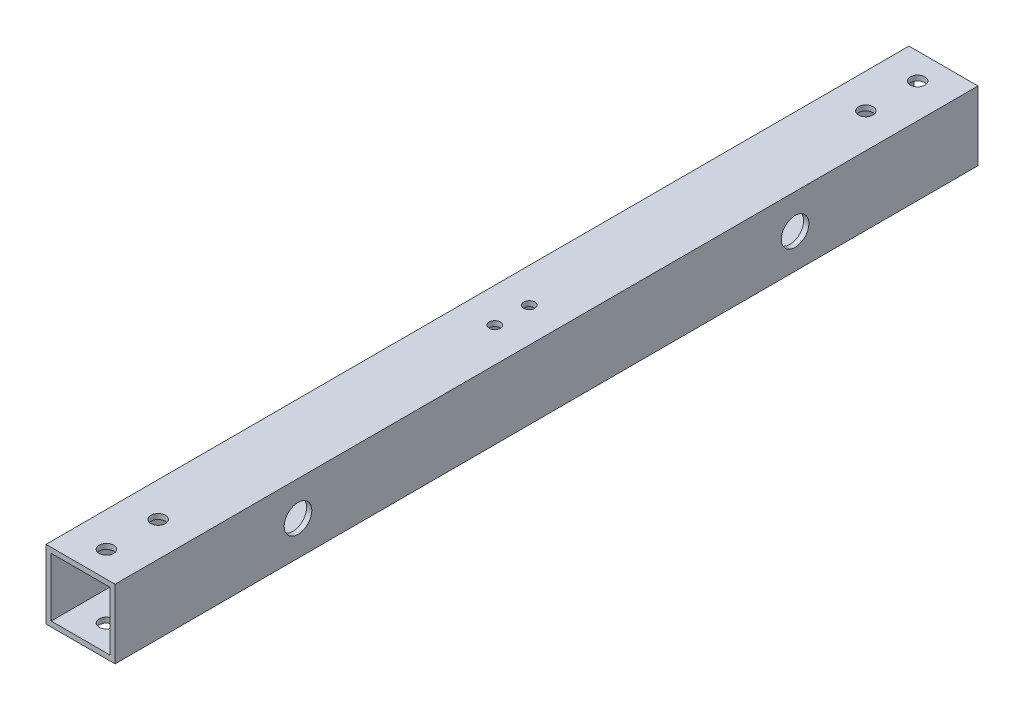
ISO-10303-21;
HEADER;
FILE_DESCRIPTION(('STEP AP214'),'2;1');
FILE_NAME('part.step','',(''),(''),'','','');
FILE_SCHEMA(('AUTOMOTIVE_DESIGN { 1 0 10303 214 1 1 1 1 }'));
ENDSEC;
DATA;
#1=APPLICATION_CONTEXT('core data for automotive mechanical design processes');
#2=APPLICATION_PROTOCOL_DEFINITION('international standard','automotive_design',2000,#1);
#3=PRODUCT_CONTEXT('',#1,'mechanical');
#4=PRODUCT('Part','Part','',(#3));
#5=PRODUCT_RELATED_PRODUCT_CATEGORY('part','',(#4));
#6=PRODUCT_DEFINITION_FORMATION('','',#4);
#7=PRODUCT_DEFINITION_CONTEXT('part definition',#1,'design');
#8=PRODUCT_DEFINITION('design','',#6,#7);
#9=PRODUCT_DEFINITION_SHAPE('','',#8);
#10=(LENGTH_UNIT() NAMED_UNIT(*) SI_UNIT(.MILLI.,.METRE.));
#11=(NAMED_UNIT(*) PLANE_ANGLE_UNIT() SI_UNIT($,.RADIAN.));
#12=(NAMED_UNIT(*) SI_UNIT($,.STERADIAN.) SOLID_ANGLE_UNIT());
#13=UNCERTAINTY_MEASURE_WITH_UNIT(LENGTH_MEASURE(1.E-05),#10,'distance_accuracy_value','');
#14=(GEOMETRIC_REPRESENTATION_CONTEXT(3) GLOBAL_UNCERTAINTY_ASSIGNED_CONTEXT((#13)) GLOBAL_UNIT_ASSIGNED_CONTEXT((#10,
#11,#12)) REPRESENTATION_CONTEXT('',''));
#15=CARTESIAN_POINT('',(0.,0.,0.));
#16=DIRECTION('',(0.,0.,1.));
#17=DIRECTION('',(1.,0.,0.));
#18=AXIS2_PLACEMENT_3D('',#15,#16,#17);
#19=CARTESIAN_POINT('',(0.,0.,250.));
#20=DIRECTION('',(0.,0.,-1.));
#21=DIRECTION('',(-1.,0.,0.));
#22=AXIS2_PLACEMENT_3D('',#19,#20,#21);
#23=PLANE('',#22);
#24=DIRECTION('',(0.,1.,0.));
#25=VECTOR('',#24,1.);
#26=CARTESIAN_POINT('',(10.,-10.,250.));
#27=LINE('',#26,#25);
#28=CARTESIAN_POINT('',(10.,-10.,250.));
#29=VERTEX_POINT('',#28);
#30=CARTESIAN_POINT('',(10.,10.,250.));
#31=VERTEX_POINT('',#30);
#32=EDGE_CURVE('E143',#29,#31,#27,.T.);
#33=ORIENTED_EDGE('',*,*,#32,.T.);
#34=DIRECTION('',(-1.,0.,0.));
#35=VECTOR('',#34,1.);
#36=CARTESIAN_POINT('',(-10.,10.,250.));
#37=LINE('',#36,#35);
#38=CARTESIAN_POINT('',(-10.,10.,250.));
#39=VERTEX_POINT('',#38);
#40=EDGE_CURVE('E146',#31,#39,#37,.T.);
#41=ORIENTED_EDGE('',*,*,#40,.T.);
#42=DIRECTION('',(0.,-1.,0.));
#43=VECTOR('',#42,1.);
#44=CARTESIAN_POINT('',(-10.,-10.,250.));
#45=LINE('',#44,#43);
#46=CARTESIAN_POINT('',(-10.,-10.,250.));
#47=VERTEX_POINT('',#46);
#48=EDGE_CURVE('E149',#39,#47,#45,.T.);
#49=ORIENTED_EDGE('',*,*,#48,.T.);
#50=DIRECTION('',(1.,0.,0.));
#51=VECTOR('',#50,1.);
#52=CARTESIAN_POINT('',(-10.,-10.,250.));
#53=LINE('',#52,#51);
#54=EDGE_CURVE('E151',#47,#29,#53,.T.);
#55=ORIENTED_EDGE('',*,*,#54,.T.);
#56=EDGE_LOOP('',(#33,#41,#49,#55));
#57=FACE_BOUND('',#56,.T.);
#58=DIRECTION('',(0.,-1.,0.));
#59=VECTOR('',#58,1.);
#60=CARTESIAN_POINT('',(-8.5,-8.5,250.));
#61=LINE('',#60,#59);
#62=CARTESIAN_POINT('',(-8.5,8.5,250.));
#63=VERTEX_POINT('',#62);
#64=CARTESIAN_POINT('',(-8.5,-8.5,250.));
#65=VERTEX_POINT('',#64);
#66=EDGE_CURVE('E105',#63,#65,#61,.T.);
#67=ORIENTED_EDGE('',*,*,#66,.F.);
#68=DIRECTION('',(-1.,0.,0.));
#69=VECTOR('',#68,1.);
#70=CARTESIAN_POINT('',(-8.5,8.5,250.));
#71=LINE('',#70,#69);
#72=CARTESIAN_POINT('',(8.5,8.50000000000001,250.));
#73=VERTEX_POINT('',#72);
#74=EDGE_CURVE('E127',#73,#63,#71,.T.);
#75=ORIENTED_EDGE('',*,*,#74,.F.);
#76=DIRECTION('',(0.,1.,0.));
#77=VECTOR('',#76,1.);
#78=CARTESIAN_POINT('',(8.5,-8.5,250.));
#79=LINE('',#78,#77);
#80=CARTESIAN_POINT('',(8.5,-8.5,250.));
#81=VERTEX_POINT('',#80);
#82=EDGE_CURVE('E125',#81,#73,#79,.T.);
#83=ORIENTED_EDGE('',*,*,#82,.F.);
#84=DIRECTION('',(1.,0.,0.));
#85=VECTOR('',#84,1.);
#86=CARTESIAN_POINT('',(-8.5,-8.5,250.));
#87=LINE('',#86,#85);
#88=EDGE_CURVE('E113',#65,#81,#87,.T.);
#89=ORIENTED_EDGE('',*,*,#88,.F.);
#90=EDGE_LOOP('',(#67,#75,#83,#89));
#91=FACE_BOUND('',#90,.T.);
#92=ADVANCED_FACE('F38',(#57,#91),#23,.F.);
#93=CARTESIAN_POINT('',(0.,0.,0.));
#94=DIRECTION('',(0.,0.,-1.));
#95=DIRECTION('',(-1.,0.,0.));
#96=AXIS2_PLACEMENT_3D('',#93,#94,#95);
#97=PLANE('',#96);
#98=DIRECTION('',(0.,1.,0.));
#99=VECTOR('',#98,1.);
#100=CARTESIAN_POINT('',(10.,-10.,0.));
#101=LINE('',#100,#99);
#102=CARTESIAN_POINT('',(10.,-10.,0.));
#103=VERTEX_POINT('',#102);
#104=CARTESIAN_POINT('',(10.,10.,0.));
#105=VERTEX_POINT('',#104);
#106=EDGE_CURVE('E121',#103,#105,#101,.T.);
#107=ORIENTED_EDGE('',*,*,#106,.F.);
#108=DIRECTION('',(1.,0.,0.));
#109=VECTOR('',#108,1.);
#110=CARTESIAN_POINT('',(-10.,-10.,0.));
#111=LINE('',#110,#109);
#112=CARTESIAN_POINT('',(-10.,-10.,0.));
#113=VERTEX_POINT('',#112);
#114=EDGE_CURVE('E147',#113,#103,#111,.T.);
#115=ORIENTED_EDGE('',*,*,#114,.F.);
#116=DIRECTION('',(0.,-1.,0.));
#117=VECTOR('',#116,1.);
#118=CARTESIAN_POINT('',(-10.,-10.,0.));
#119=LINE('',#118,#117);
#120=CARTESIAN_POINT('',(-10.,10.,0.));
#121=VERTEX_POINT('',#120);
#122=EDGE_CURVE('E158',#121,#113,#119,.T.);
#123=ORIENTED_EDGE('',*,*,#122,.F.);
#124=DIRECTION('',(-1.,0.,0.));
#125=VECTOR('',#124,1.);
#126=CARTESIAN_POINT('',(-10.,10.,0.));
#127=LINE('',#126,#125);
#128=EDGE_CURVE('E156',#105,#121,#127,.T.);
#129=ORIENTED_EDGE('',*,*,#128,.F.);
#130=EDGE_LOOP('',(#107,#115,#123,#129));
#131=FACE_BOUND('',#130,.T.);
#132=DIRECTION('',(-1.,0.,0.));
#133=VECTOR('',#132,1.);
#134=CARTESIAN_POINT('',(-8.5,8.5,0.));
#135=LINE('',#134,#133);
#136=CARTESIAN_POINT('',(8.5,8.50000000000001,0.));
#137=VERTEX_POINT('',#136);
#138=CARTESIAN_POINT('',(-8.5,8.5,0.));
#139=VERTEX_POINT('',#138);
#140=EDGE_CURVE('E114',#137,#139,#135,.T.);
#141=ORIENTED_EDGE('',*,*,#140,.T.);
#142=DIRECTION('',(0.,-1.,0.));
#143=VECTOR('',#142,1.);
#144=CARTESIAN_POINT('',(-8.5,-8.5,0.));
#145=LINE('',#144,#143);
#146=CARTESIAN_POINT('',(-8.5,-8.5,0.));
#147=VERTEX_POINT('',#146);
#148=EDGE_CURVE('E63',#139,#147,#145,.T.);
#149=ORIENTED_EDGE('',*,*,#148,.T.);
#150=DIRECTION('',(1.,0.,0.));
#151=VECTOR('',#150,1.);
#152=CARTESIAN_POINT('',(-8.5,-8.5,0.));
#153=LINE('',#152,#151);
#154=CARTESIAN_POINT('',(8.5,-8.5,0.));
#155=VERTEX_POINT('',#154);
#156=EDGE_CURVE('E120',#147,#155,#153,.T.);
#157=ORIENTED_EDGE('',*,*,#156,.T.);
#158=DIRECTION('',(0.,1.,0.));
#159=VECTOR('',#158,1.);
#160=CARTESIAN_POINT('',(8.5,-8.5,0.));
#161=LINE('',#160,#159);
#162=EDGE_CURVE('E135',#155,#137,#161,.T.);
#163=ORIENTED_EDGE('',*,*,#162,.T.);
#164=EDGE_LOOP('',(#141,#149,#157,#163));
#165=FACE_BOUND('',#164,.T.);
#166=ADVANCED_FACE('F305',(#131,#165),#97,.T.);
#167=CARTESIAN_POINT('',(10.,-10.,250.));
#168=DIRECTION('',(-1.,0.,0.));
#169=DIRECTION('',(0.,0.,1.));
#170=AXIS2_PLACEMENT_3D('',#167,#168,#169);
#171=PLANE('',#170);
#172=CARTESIAN_POINT('',(10.,0.,197.));
#173=DIRECTION('',(-1.,0.,0.));
#174=DIRECTION('',(0.,0.,1.));
#175=AXIS2_PLACEMENT_3D('',#172,#173,#174);
#176=CIRCLE('',#175,3.99999999999999);
#177=CARTESIAN_POINT('',(10.,0.,201.));
#178=VERTEX_POINT('',#177);
#179=EDGE_CURVE('E194',#178,#178,#176,.T.);
#180=ORIENTED_EDGE('',*,*,#179,.T.);
#181=EDGE_LOOP('',(#180));
#182=FACE_BOUND('',#181,.T.);
#183=CARTESIAN_POINT('',(10.,0.,53.));
#184=DIRECTION('',(-1.,0.,0.));
#185=DIRECTION('',(0.,0.,-1.));
#186=AXIS2_PLACEMENT_3D('',#183,#184,#185);
#187=CIRCLE('',#186,4.00000000000001);
#188=CARTESIAN_POINT('',(10.,0.,49.));
#189=VERTEX_POINT('',#188);
#190=EDGE_CURVE('E205',#189,#189,#187,.T.);
#191=ORIENTED_EDGE('',*,*,#190,.T.);
#192=EDGE_LOOP('',(#191));
#193=FACE_BOUND('',#192,.T.);
#194=ORIENTED_EDGE('',*,*,#106,.T.);
#195=DIRECTION('',(0.,0.,-1.));
#196=VECTOR('',#195,1.);
#197=CARTESIAN_POINT('',(10.,10.,250.));
#198=LINE('',#197,#196);
#199=EDGE_CURVE('E11',#31,#105,#198,.T.);
#200=ORIENTED_EDGE('',*,*,#199,.F.);
#201=ORIENTED_EDGE('',*,*,#32,.F.);
#202=DIRECTION('',(0.,0.,-1.));
#203=VECTOR('',#202,1.);
#204=CARTESIAN_POINT('',(10.,-10.,250.));
#205=LINE('',#204,#203);
#206=EDGE_CURVE('E153',#29,#103,#205,.T.);
#207=ORIENTED_EDGE('',*,*,#206,.T.);
#208=EDGE_LOOP('',(#194,#200,#201,#207));
#209=FACE_BOUND('',#208,.T.);
#210=ADVANCED_FACE('F40',(#182,#193,#209),#171,.F.);
#211=CARTESIAN_POINT('',(-10.,10.,250.));
#212=DIRECTION('',(0.,-1.,0.));
#213=DIRECTION('',(0.,0.,-1.));
#214=AXIS2_PLACEMENT_3D('',#211,#212,#213);
#215=PLANE('',#214);
#216=CARTESIAN_POINT('',(0.,10.,7.5));
#217=DIRECTION('',(0.,1.,0.));
#218=DIRECTION('',(0.,0.,1.));
#219=AXIS2_PLACEMENT_3D('',#216,#217,#218);
#220=CIRCLE('',#219,2.1);
#221=CARTESIAN_POINT('',(0.,10.,9.6));
#222=VERTEX_POINT('',#221);
#223=EDGE_CURVE('E219',#222,#222,#220,.T.);
#224=ORIENTED_EDGE('',*,*,#223,.F.);
#225=EDGE_LOOP('',(#224));
#226=FACE_BOUND('',#225,.T.);
#227=CARTESIAN_POINT('',(0.,10.,22.5));
#228=DIRECTION('',(0.,1.,0.));
#229=DIRECTION('',(0.,0.,1.));
#230=AXIS2_PLACEMENT_3D('',#227,#228,#229);
#231=CIRCLE('',#230,2.1);
#232=CARTESIAN_POINT('',(0.,10.,24.6));
#233=VERTEX_POINT('',#232);
#234=EDGE_CURVE('E225',#233,#233,#231,.T.);
#235=ORIENTED_EDGE('',*,*,#234,.F.);
#236=EDGE_LOOP('',(#235));
#237=FACE_BOUND('',#236,.T.);
#238=CARTESIAN_POINT('',(0.,10.,120.));
#239=DIRECTION('',(0.,1.,0.));
#240=DIRECTION('',(0.,0.,1.));
#241=AXIS2_PLACEMENT_3D('',#238,#239,#240);
#242=CIRCLE('',#241,1.6);
#243=CARTESIAN_POINT('',(0.,10.,121.6));
#244=VERTEX_POINT('',#243);
#245=EDGE_CURVE('E231',#244,#244,#242,.T.);
#246=ORIENTED_EDGE('',*,*,#245,.F.);
#247=EDGE_LOOP('',(#246));
#248=FACE_BOUND('',#247,.T.);
#249=CARTESIAN_POINT('',(0.,10.,130.));
#250=DIRECTION('',(0.,1.,0.));
#251=DIRECTION('',(0.,0.,-1.));
#252=AXIS2_PLACEMENT_3D('',#249,#250,#251);
#253=CIRCLE('',#252,1.59999999999999);
#254=CARTESIAN_POINT('',(0.,10.,128.4));
#255=VERTEX_POINT('',#254);
#256=EDGE_CURVE('E237',#255,#255,#253,.T.);
#257=ORIENTED_EDGE('',*,*,#256,.F.);
#258=EDGE_LOOP('',(#257));
#259=FACE_BOUND('',#258,.T.);
#260=CARTESIAN_POINT('',(0.,10.,227.5));
#261=DIRECTION('',(0.,1.,0.));
#262=DIRECTION('',(0.,0.,-1.));
#263=AXIS2_PLACEMENT_3D('',#260,#261,#262);
#264=CIRCLE('',#263,2.1);
#265=CARTESIAN_POINT('',(0.,10.,225.4));
#266=VERTEX_POINT('',#265);
#267=EDGE_CURVE('E243',#266,#266,#264,.T.);
#268=ORIENTED_EDGE('',*,*,#267,.F.);
#269=EDGE_LOOP('',(#268));
#270=FACE_BOUND('',#269,.T.);
#271=CARTESIAN_POINT('',(0.,10.,242.5));
#272=DIRECTION('',(0.,1.,0.));
#273=DIRECTION('',(0.,0.,-1.));
#274=AXIS2_PLACEMENT_3D('',#271,#272,#273);
#275=CIRCLE('',#274,2.1);
#276=CARTESIAN_POINT('',(0.,10.,240.4));
#277=VERTEX_POINT('',#276);
#278=EDGE_CURVE('E216',#277,#277,#275,.T.);
#279=ORIENTED_EDGE('',*,*,#278,.F.);
#280=EDGE_LOOP('',(#279));
#281=FACE_BOUND('',#280,.T.);
#282=ORIENTED_EDGE('',*,*,#128,.T.);
#283=DIRECTION('',(0.,0.,-1.));
#284=VECTOR('',#283,1.);
#285=CARTESIAN_POINT('',(-10.,10.,250.));
#286=LINE('',#285,#284);
#287=EDGE_CURVE('E47',#39,#121,#286,.T.);
#288=ORIENTED_EDGE('',*,*,#287,.F.);
#289=ORIENTED_EDGE('',*,*,#40,.F.);
#290=ORIENTED_EDGE('',*,*,#199,.T.);
#291=EDGE_LOOP('',(#282,#288,#289,#290));
#292=FACE_BOUND('',#291,.T.);
#293=ADVANCED_FACE('F309',(#226,#237,#248,#259,#270,#281,#292),#215,.F.);
#294=CARTESIAN_POINT('',(-10.,-10.,250.));
#295=DIRECTION('',(1.,0.,0.));
#296=DIRECTION('',(0.,0.,-1.));
#297=AXIS2_PLACEMENT_3D('',#294,#295,#296);
#298=PLANE('',#297);
#299=CARTESIAN_POINT('',(-10.,0.,197.));
#300=DIRECTION('',(-1.,0.,0.));
#301=DIRECTION('',(0.,0.,1.));
#302=AXIS2_PLACEMENT_3D('',#299,#300,#301);
#303=CIRCLE('',#302,3.99999999999999);
#304=CARTESIAN_POINT('',(-10.,0.,201.));
#305=VERTEX_POINT('',#304);
#306=EDGE_CURVE('E200',#305,#305,#303,.T.);
#307=ORIENTED_EDGE('',*,*,#306,.F.);
#308=EDGE_LOOP('',(#307));
#309=FACE_BOUND('',#308,.T.);
#310=CARTESIAN_POINT('',(-10.,0.,53.));
#311=DIRECTION('',(-1.,0.,0.));
#312=DIRECTION('',(0.,0.,-1.));
#313=AXIS2_PLACEMENT_3D('',#310,#311,#312);
#314=CIRCLE('',#313,4.00000000000001);
#315=CARTESIAN_POINT('',(-10.,0.,49.));
#316=VERTEX_POINT('',#315);
#317=EDGE_CURVE('E210',#316,#316,#314,.T.);
#318=ORIENTED_EDGE('',*,*,#317,.F.);
#319=EDGE_LOOP('',(#318));
#320=FACE_BOUND('',#319,.T.);
#321=ORIENTED_EDGE('',*,*,#122,.T.);
#322=DIRECTION('',(0.,0.,-1.));
#323=VECTOR('',#322,1.);
#324=CARTESIAN_POINT('',(-10.,-10.,250.));
#325=LINE('',#324,#323);
#326=EDGE_CURVE('E163',#47,#113,#325,.T.);
#327=ORIENTED_EDGE('',*,*,#326,.F.);
#328=ORIENTED_EDGE('',*,*,#48,.F.);
#329=ORIENTED_EDGE('',*,*,#287,.T.);
#330=EDGE_LOOP('',(#321,#327,#328,#329));
#331=FACE_BOUND('',#330,.T.);
#332=ADVANCED_FACE('F292',(#309,#320,#331),#298,.F.);
#333=CARTESIAN_POINT('',(-10.,-10.,250.));
#334=DIRECTION('',(0.,1.,0.));
#335=DIRECTION('',(0.,0.,1.));
#336=AXIS2_PLACEMENT_3D('',#333,#334,#335);
#337=PLANE('',#336);
#338=CARTESIAN_POINT('',(0.,-10.,7.5));
#339=DIRECTION('',(0.,1.,0.));
#340=DIRECTION('',(0.,0.,1.));
#341=AXIS2_PLACEMENT_3D('',#338,#339,#340);
#342=CIRCLE('',#341,2.1);
#343=CARTESIAN_POINT('',(0.,-10.,9.6));
#344=VERTEX_POINT('',#343);
#345=EDGE_CURVE('E172',#344,#344,#342,.T.);
#346=ORIENTED_EDGE('',*,*,#345,.T.);
#347=EDGE_LOOP('',(#346));
#348=FACE_BOUND('',#347,.T.);
#349=CARTESIAN_POINT('',(0.,-10.,22.5));
#350=DIRECTION('',(0.,1.,0.));
#351=DIRECTION('',(0.,0.,1.));
#352=AXIS2_PLACEMENT_3D('',#349,#350,#351);
#353=CIRCLE('',#352,2.1);
#354=CARTESIAN_POINT('',(0.,-10.,24.6));
#355=VERTEX_POINT('',#354);
#356=EDGE_CURVE('E222',#355,#355,#353,.T.);
#357=ORIENTED_EDGE('',*,*,#356,.T.);
#358=EDGE_LOOP('',(#357));
#359=FACE_BOUND('',#358,.T.);
#360=CARTESIAN_POINT('',(0.,-10.,120.));
#361=DIRECTION('',(0.,1.,0.));
#362=DIRECTION('',(0.,0.,1.));
#363=AXIS2_PLACEMENT_3D('',#360,#361,#362);
#364=CIRCLE('',#363,1.6);
#365=CARTESIAN_POINT('',(0.,-10.,121.6));
#366=VERTEX_POINT('',#365);
#367=EDGE_CURVE('E228',#366,#366,#364,.T.);
#368=ORIENTED_EDGE('',*,*,#367,.T.);
#369=EDGE_LOOP('',(#368));
#370=FACE_BOUND('',#369,.T.);
#371=CARTESIAN_POINT('',(0.,-10.,130.));
#372=DIRECTION('',(0.,1.,0.));
#373=DIRECTION('',(0.,0.,-1.));
#374=AXIS2_PLACEMENT_3D('',#371,#372,#373);
#375=CIRCLE('',#374,1.59999999999999);
#376=CARTESIAN_POINT('',(0.,-10.,128.4));
#377=VERTEX_POINT('',#376);
#378=EDGE_CURVE('E234',#377,#377,#375,.T.);
#379=ORIENTED_EDGE('',*,*,#378,.T.);
#380=EDGE_LOOP('',(#379));
#381=FACE_BOUND('',#380,.T.);
#382=CARTESIAN_POINT('',(0.,-10.,227.5));
#383=DIRECTION('',(0.,1.,0.));
#384=DIRECTION('',(0.,0.,-1.));
#385=AXIS2_PLACEMENT_3D('',#382,#383,#384);
#386=CIRCLE('',#385,2.1);
#387=CARTESIAN_POINT('',(0.,-10.,225.4));
#388=VERTEX_POINT('',#387);
#389=EDGE_CURVE('E240',#388,#388,#386,.T.);
#390=ORIENTED_EDGE('',*,*,#389,.T.);
#391=EDGE_LOOP('',(#390));
#392=FACE_BOUND('',#391,.T.);
#393=CARTESIAN_POINT('',(0.,-10.,242.5));
#394=DIRECTION('',(0.,1.,0.));
#395=DIRECTION('',(0.,0.,-1.));
#396=AXIS2_PLACEMENT_3D('',#393,#394,#395);
#397=CIRCLE('',#396,2.1);
#398=CARTESIAN_POINT('',(0.,-10.,240.4));
#399=VERTEX_POINT('',#398);
#400=EDGE_CURVE('E246',#399,#399,#397,.T.);
#401=ORIENTED_EDGE('',*,*,#400,.T.);
#402=EDGE_LOOP('',(#401));
#403=FACE_BOUND('',#402,.T.);
#404=ORIENTED_EDGE('',*,*,#114,.T.);
#405=ORIENTED_EDGE('',*,*,#206,.F.);
#406=ORIENTED_EDGE('',*,*,#54,.F.);
#407=ORIENTED_EDGE('',*,*,#326,.T.);
#408=EDGE_LOOP('',(#404,#405,#406,#407));
#409=FACE_BOUND('',#408,.T.);
#410=ADVANCED_FACE('F289',(#348,#359,#370,#381,#392,#403,#409),#337,.F.);
#411=CARTESIAN_POINT('',(-8.5,-8.5,250.));
#412=DIRECTION('',(1.,0.,0.));
#413=DIRECTION('',(0.,0.,-1.));
#414=AXIS2_PLACEMENT_3D('',#411,#412,#413);
#415=PLANE('',#414);
#416=CARTESIAN_POINT('',(-8.5,0.,197.));
#417=DIRECTION('',(1.,0.,0.));
#418=DIRECTION('',(0.,0.,-1.));
#419=AXIS2_PLACEMENT_3D('',#416,#417,#418);
#420=CIRCLE('',#419,3.99999999999999);
#421=CARTESIAN_POINT('',(-8.5,0.,193.));
#422=VERTEX_POINT('',#421);
#423=EDGE_CURVE('E213',#422,#422,#420,.T.);
#424=ORIENTED_EDGE('',*,*,#423,.F.);
#425=EDGE_LOOP('',(#424));
#426=FACE_BOUND('',#425,.T.);
#427=CARTESIAN_POINT('',(-8.5,0.,53.));
#428=DIRECTION('',(1.,0.,0.));
#429=DIRECTION('',(0.,0.,-1.));
#430=AXIS2_PLACEMENT_3D('',#427,#428,#429);
#431=CIRCLE('',#430,4.00000000000001);
#432=CARTESIAN_POINT('',(-8.5,0.,49.));
#433=VERTEX_POINT('',#432);
#434=EDGE_CURVE('E193',#433,#433,#431,.T.);
#435=ORIENTED_EDGE('',*,*,#434,.F.);
#436=EDGE_LOOP('',(#435));
#437=FACE_BOUND('',#436,.T.);
#438=ORIENTED_EDGE('',*,*,#148,.F.);
#439=DIRECTION('',(0.,0.,-1.));
#440=VECTOR('',#439,1.);
#441=CARTESIAN_POINT('',(-8.5,8.5,250.));
#442=LINE('',#441,#440);
#443=EDGE_CURVE('E109',#63,#139,#442,.T.);
#444=ORIENTED_EDGE('',*,*,#443,.F.);
#445=ORIENTED_EDGE('',*,*,#66,.T.);
#446=DIRECTION('',(0.,0.,-1.));
#447=VECTOR('',#446,1.);
#448=CARTESIAN_POINT('',(-8.5,-8.5,250.));
#449=LINE('',#448,#447);
#450=EDGE_CURVE('E108',#65,#147,#449,.T.);
#451=ORIENTED_EDGE('',*,*,#450,.T.);
#452=EDGE_LOOP('',(#438,#444,#445,#451));
#453=FACE_BOUND('',#452,.T.);
#454=ADVANCED_FACE('F107',(#426,#437,#453),#415,.T.);
#455=CARTESIAN_POINT('',(-8.5,-8.5,250.));
#456=DIRECTION('',(0.,1.,0.));
#457=DIRECTION('',(0.,0.,1.));
#458=AXIS2_PLACEMENT_3D('',#455,#456,#457);
#459=PLANE('',#458);
#460=CARTESIAN_POINT('',(0.,-8.5,7.5));
#461=DIRECTION('',(0.,1.,0.));
#462=DIRECTION('',(0.,0.,1.));
#463=AXIS2_PLACEMENT_3D('',#460,#461,#462);
#464=CIRCLE('',#463,2.1);
#465=CARTESIAN_POINT('',(0.,-8.5,9.6));
#466=VERTEX_POINT('',#465);
#467=EDGE_CURVE('E133',#466,#466,#464,.T.);
#468=ORIENTED_EDGE('',*,*,#467,.F.);
#469=EDGE_LOOP('',(#468));
#470=FACE_BOUND('',#469,.T.);
#471=CARTESIAN_POINT('',(0.,-8.5,22.5));
#472=DIRECTION('',(0.,1.,0.));
#473=DIRECTION('',(0.,0.,1.));
#474=AXIS2_PLACEMENT_3D('',#471,#472,#473);
#475=CIRCLE('',#474,2.1);
#476=CARTESIAN_POINT('',(0.,-8.5,24.6));
#477=VERTEX_POINT('',#476);
#478=EDGE_CURVE('E188',#477,#477,#475,.T.);
#479=ORIENTED_EDGE('',*,*,#478,.F.);
#480=EDGE_LOOP('',(#479));
#481=FACE_BOUND('',#480,.T.);
#482=CARTESIAN_POINT('',(0.,-8.5,120.));
#483=DIRECTION('',(0.,1.,0.));
#484=DIRECTION('',(0.,0.,1.));
#485=AXIS2_PLACEMENT_3D('',#482,#483,#484);
#486=CIRCLE('',#485,1.6);
#487=CARTESIAN_POINT('',(0.,-8.5,121.6));
#488=VERTEX_POINT('',#487);
#489=EDGE_CURVE('E184',#488,#488,#486,.T.);
#490=ORIENTED_EDGE('',*,*,#489,.F.);
#491=EDGE_LOOP('',(#490));
#492=FACE_BOUND('',#491,.T.);
#493=CARTESIAN_POINT('',(0.,-8.5,130.));
#494=DIRECTION('',(0.,1.,0.));
#495=DIRECTION('',(0.,0.,1.));
#496=AXIS2_PLACEMENT_3D('',#493,#494,#495);
#497=CIRCLE('',#496,1.59999999999999);
#498=CARTESIAN_POINT('',(0.,-8.5,131.6));
#499=VERTEX_POINT('',#498);
#500=EDGE_CURVE('E180',#499,#499,#497,.T.);
#501=ORIENTED_EDGE('',*,*,#500,.F.);
#502=EDGE_LOOP('',(#501));
#503=FACE_BOUND('',#502,.T.);
#504=CARTESIAN_POINT('',(0.,-8.5,227.5));
#505=DIRECTION('',(0.,1.,0.));
#506=DIRECTION('',(0.,0.,1.));
#507=AXIS2_PLACEMENT_3D('',#504,#505,#506);
#508=CIRCLE('',#507,2.1);
#509=CARTESIAN_POINT('',(0.,-8.5,229.6));
#510=VERTEX_POINT('',#509);
#511=EDGE_CURVE('E176',#510,#510,#508,.T.);
#512=ORIENTED_EDGE('',*,*,#511,.F.);
#513=EDGE_LOOP('',(#512));
#514=FACE_BOUND('',#513,.T.);
#515=CARTESIAN_POINT('',(0.,-8.5,242.5));
#516=DIRECTION('',(0.,1.,0.));
#517=DIRECTION('',(0.,0.,1.));
#518=AXIS2_PLACEMENT_3D('',#515,#516,#517);
#519=CIRCLE('',#518,2.1);
#520=CARTESIAN_POINT('',(0.,-8.5,244.6));
#521=VERTEX_POINT('',#520);
#522=EDGE_CURVE('E171',#521,#521,#519,.T.);
#523=ORIENTED_EDGE('',*,*,#522,.F.);
#524=EDGE_LOOP('',(#523));
#525=FACE_BOUND('',#524,.T.);
#526=ORIENTED_EDGE('',*,*,#156,.F.);
#527=ORIENTED_EDGE('',*,*,#450,.F.);
#528=ORIENTED_EDGE('',*,*,#88,.T.);
#529=DIRECTION('',(0.,0.,-1.));
#530=VECTOR('',#529,1.);
#531=CARTESIAN_POINT('',(8.5,-8.5,250.));
#532=LINE('',#531,#530);
#533=EDGE_CURVE('E122',#81,#155,#532,.T.);
#534=ORIENTED_EDGE('',*,*,#533,.T.);
#535=EDGE_LOOP('',(#526,#527,#528,#534));
#536=FACE_BOUND('',#535,.T.);
#537=ADVANCED_FACE('F117',(#470,#481,#492,#503,#514,#525,#536),#459,.T.);
#538=CARTESIAN_POINT('',(8.5,-8.5,250.));
#539=DIRECTION('',(-1.,0.,0.));
#540=DIRECTION('',(0.,-1.,0.));
#541=AXIS2_PLACEMENT_3D('',#538,#539,#540);
#542=PLANE('',#541);
#543=CARTESIAN_POINT('',(8.5,0.,197.));
#544=DIRECTION('',(-1.,0.,0.));
#545=DIRECTION('',(0.,-1.,0.));
#546=AXIS2_PLACEMENT_3D('',#543,#544,#545);
#547=CIRCLE('',#546,3.99999999999999);
#548=CARTESIAN_POINT('',(8.5,-3.99999999999999,197.));
#549=VERTEX_POINT('',#548);
#550=EDGE_CURVE('E42',#549,#549,#547,.T.);
#551=ORIENTED_EDGE('',*,*,#550,.F.);
#552=EDGE_LOOP('',(#551));
#553=FACE_BOUND('',#552,.T.);
#554=CARTESIAN_POINT('',(8.5,0.,53.));
#555=DIRECTION('',(-1.,0.,0.));
#556=DIRECTION('',(0.,-1.,0.));
#557=AXIS2_PLACEMENT_3D('',#554,#555,#556);
#558=CIRCLE('',#557,4.00000000000001);
#559=CARTESIAN_POINT('',(8.5,-4.00000000000002,53.));
#560=VERTEX_POINT('',#559);
#561=EDGE_CURVE('E191',#560,#560,#558,.T.);
#562=ORIENTED_EDGE('',*,*,#561,.F.);
#563=EDGE_LOOP('',(#562));
#564=FACE_BOUND('',#563,.T.);
#565=ORIENTED_EDGE('',*,*,#162,.F.);
#566=ORIENTED_EDGE('',*,*,#533,.F.);
#567=ORIENTED_EDGE('',*,*,#82,.T.);
#568=DIRECTION('',(0.,0.,-1.));
#569=VECTOR('',#568,1.);
#570=CARTESIAN_POINT('',(8.5,8.50000000000001,250.));
#571=LINE('',#570,#569);
#572=EDGE_CURVE('E55',#73,#137,#571,.T.);
#573=ORIENTED_EDGE('',*,*,#572,.T.);
#574=EDGE_LOOP('',(#565,#566,#567,#573));
#575=FACE_BOUND('',#574,.T.);
#576=ADVANCED_FACE('F268',(#553,#564,#575),#542,.T.);
#577=CARTESIAN_POINT('',(-8.5,8.5,250.));
#578=DIRECTION('',(0.,-1.,0.));
#579=DIRECTION('',(1.,0.,0.));
#580=AXIS2_PLACEMENT_3D('',#577,#578,#579);
#581=PLANE('',#580);
#582=CARTESIAN_POINT('',(0.,8.50000000000001,7.5));
#583=DIRECTION('',(0.,-1.,0.));
#584=DIRECTION('',(1.,0.,0.));
#585=AXIS2_PLACEMENT_3D('',#582,#583,#584);
#586=CIRCLE('',#585,2.1);
#587=CARTESIAN_POINT('',(2.1,8.50000000000001,7.5));
#588=VERTEX_POINT('',#587);
#589=EDGE_CURVE('E189',#588,#588,#586,.T.);
#590=ORIENTED_EDGE('',*,*,#589,.F.);
#591=EDGE_LOOP('',(#590));
#592=FACE_BOUND('',#591,.T.);
#593=CARTESIAN_POINT('',(0.,8.50000000000001,22.5));
#594=DIRECTION('',(0.,-1.,0.));
#595=DIRECTION('',(1.,0.,0.));
#596=AXIS2_PLACEMENT_3D('',#593,#594,#595);
#597=CIRCLE('',#596,2.1);
#598=CARTESIAN_POINT('',(2.1,8.50000000000001,22.5));
#599=VERTEX_POINT('',#598);
#600=EDGE_CURVE('E185',#599,#599,#597,.T.);
#601=ORIENTED_EDGE('',*,*,#600,.F.);
#602=EDGE_LOOP('',(#601));
#603=FACE_BOUND('',#602,.T.);
#604=CARTESIAN_POINT('',(0.,8.50000000000001,120.));
#605=DIRECTION('',(0.,-1.,0.));
#606=DIRECTION('',(1.,0.,0.));
#607=AXIS2_PLACEMENT_3D('',#604,#605,#606);
#608=CIRCLE('',#607,1.6);
#609=CARTESIAN_POINT('',(1.60000000000002,8.50000000000001,120.));
#610=VERTEX_POINT('',#609);
#611=EDGE_CURVE('E181',#610,#610,#608,.T.);
#612=ORIENTED_EDGE('',*,*,#611,.F.);
#613=EDGE_LOOP('',(#612));
#614=FACE_BOUND('',#613,.T.);
#615=CARTESIAN_POINT('',(0.,8.50000000000001,130.));
#616=DIRECTION('',(0.,-1.,0.));
#617=DIRECTION('',(1.,0.,0.));
#618=AXIS2_PLACEMENT_3D('',#615,#616,#617);
#619=CIRCLE('',#618,1.59999999999999);
#620=CARTESIAN_POINT('',(1.60000000000001,8.50000000000001,130.));
#621=VERTEX_POINT('',#620);
#622=EDGE_CURVE('E177',#621,#621,#619,.T.);
#623=ORIENTED_EDGE('',*,*,#622,.F.);
#624=EDGE_LOOP('',(#623));
#625=FACE_BOUND('',#624,.T.);
#626=CARTESIAN_POINT('',(0.,8.50000000000001,227.5));
#627=DIRECTION('',(0.,-1.,0.));
#628=DIRECTION('',(1.,0.,0.));
#629=AXIS2_PLACEMENT_3D('',#626,#627,#628);
#630=CIRCLE('',#629,2.1);
#631=CARTESIAN_POINT('',(2.1,8.50000000000001,227.5));
#632=VERTEX_POINT('',#631);
#633=EDGE_CURVE('E173',#632,#632,#630,.T.);
#634=ORIENTED_EDGE('',*,*,#633,.F.);
#635=EDGE_LOOP('',(#634));
#636=FACE_BOUND('',#635,.T.);
#637=CARTESIAN_POINT('',(0.,8.50000000000001,242.5));
#638=DIRECTION('',(0.,-1.,0.));
#639=DIRECTION('',(1.,0.,0.));
#640=AXIS2_PLACEMENT_3D('',#637,#638,#639);
#641=CIRCLE('',#640,2.1);
#642=CARTESIAN_POINT('',(2.1,8.50000000000001,242.5));
#643=VERTEX_POINT('',#642);
#644=EDGE_CURVE('E168',#643,#643,#641,.T.);
#645=ORIENTED_EDGE('',*,*,#644,.F.);
#646=EDGE_LOOP('',(#645));
#647=FACE_BOUND('',#646,.T.);
#648=ORIENTED_EDGE('',*,*,#140,.F.);
#649=ORIENTED_EDGE('',*,*,#572,.F.);
#650=ORIENTED_EDGE('',*,*,#74,.T.);
#651=ORIENTED_EDGE('',*,*,#443,.T.);
#652=EDGE_LOOP('',(#648,#649,#650,#651));
#653=FACE_BOUND('',#652,.T.);
#654=ADVANCED_FACE('F334',(#592,#603,#614,#625,#636,#647,#653),#581,.T.);
#655=CARTESIAN_POINT('',(0.,-10.,242.5));
#656=DIRECTION('',(0.,1.,0.));
#657=DIRECTION('',(0.,0.,1.));
#658=AXIS2_PLACEMENT_3D('',#655,#656,#657);
#659=CYLINDRICAL_SURFACE('',#658,2.1);
#660=ORIENTED_EDGE('',*,*,#644,.T.);
#661=EDGE_LOOP('',(#660));
#662=FACE_BOUND('',#661,.T.);
#663=ORIENTED_EDGE('',*,*,#278,.T.);
#664=EDGE_LOOP('',(#663));
#665=FACE_BOUND('',#664,.T.);
#666=ADVANCED_FACE('F286',(#662,#665),#659,.F.);
#667=CARTESIAN_POINT('',(0.,-10.,227.5));
#668=DIRECTION('',(0.,1.,0.));
#669=DIRECTION('',(0.,0.,1.));
#670=AXIS2_PLACEMENT_3D('',#667,#668,#669);
#671=CYLINDRICAL_SURFACE('',#670,2.1);
#672=ORIENTED_EDGE('',*,*,#633,.T.);
#673=EDGE_LOOP('',(#672));
#674=FACE_BOUND('',#673,.T.);
#675=ORIENTED_EDGE('',*,*,#267,.T.);
#676=EDGE_LOOP('',(#675));
#677=FACE_BOUND('',#676,.T.);
#678=ADVANCED_FACE('F340',(#674,#677),#671,.F.);
#679=CARTESIAN_POINT('',(0.,-10.,130.));
#680=DIRECTION('',(0.,1.,0.));
#681=DIRECTION('',(0.,0.,1.));
#682=AXIS2_PLACEMENT_3D('',#679,#680,#681);
#683=CYLINDRICAL_SURFACE('',#682,1.59999999999999);
#684=ORIENTED_EDGE('',*,*,#622,.T.);
#685=EDGE_LOOP('',(#684));
#686=FACE_BOUND('',#685,.T.);
#687=ORIENTED_EDGE('',*,*,#256,.T.);
#688=EDGE_LOOP('',(#687));
#689=FACE_BOUND('',#688,.T.);
#690=ADVANCED_FACE('F344',(#686,#689),#683,.F.);
#691=CARTESIAN_POINT('',(0.,-10.,120.));
#692=DIRECTION('',(0.,1.,0.));
#693=DIRECTION('',(0.,0.,1.));
#694=AXIS2_PLACEMENT_3D('',#691,#692,#693);
#695=CYLINDRICAL_SURFACE('',#694,1.6);
#696=ORIENTED_EDGE('',*,*,#611,.T.);
#697=EDGE_LOOP('',(#696));
#698=FACE_BOUND('',#697,.T.);
#699=ORIENTED_EDGE('',*,*,#245,.T.);
#700=EDGE_LOOP('',(#699));
#701=FACE_BOUND('',#700,.T.);
#702=ADVANCED_FACE('F348',(#698,#701),#695,.F.);
#703=CARTESIAN_POINT('',(0.,-10.,22.5));
#704=DIRECTION('',(0.,1.,0.));
#705=DIRECTION('',(0.,0.,1.));
#706=AXIS2_PLACEMENT_3D('',#703,#704,#705);
#707=CYLINDRICAL_SURFACE('',#706,2.1);
#708=ORIENTED_EDGE('',*,*,#600,.T.);
#709=EDGE_LOOP('',(#708));
#710=FACE_BOUND('',#709,.T.);
#711=ORIENTED_EDGE('',*,*,#234,.T.);
#712=EDGE_LOOP('',(#711));
#713=FACE_BOUND('',#712,.T.);
#714=ADVANCED_FACE('F353',(#710,#713),#707,.F.);
#715=CARTESIAN_POINT('',(0.,-10.,7.5));
#716=DIRECTION('',(0.,1.,0.));
#717=DIRECTION('',(0.,0.,1.));
#718=AXIS2_PLACEMENT_3D('',#715,#716,#717);
#719=CYLINDRICAL_SURFACE('',#718,2.1);
#720=ORIENTED_EDGE('',*,*,#589,.T.);
#721=EDGE_LOOP('',(#720));
#722=FACE_BOUND('',#721,.T.);
#723=ORIENTED_EDGE('',*,*,#223,.T.);
#724=EDGE_LOOP('',(#723));
#725=FACE_BOUND('',#724,.T.);
#726=ADVANCED_FACE('F284',(#722,#725),#719,.F.);
#727=ORIENTED_EDGE('',*,*,#522,.T.);
#728=EDGE_LOOP('',(#727));
#729=FACE_BOUND('',#728,.T.);
#730=ORIENTED_EDGE('',*,*,#400,.F.);
#731=EDGE_LOOP('',(#730));
#732=FACE_BOUND('',#731,.T.);
#733=ADVANCED_FACE('F280',(#729,#732),#659,.F.);
#734=ORIENTED_EDGE('',*,*,#511,.T.);
#735=EDGE_LOOP('',(#734));
#736=FACE_BOUND('',#735,.T.);
#737=ORIENTED_EDGE('',*,*,#389,.F.);
#738=EDGE_LOOP('',(#737));
#739=FACE_BOUND('',#738,.T.);
#740=ADVANCED_FACE('F283',(#736,#739),#671,.F.);
#741=ORIENTED_EDGE('',*,*,#500,.T.);
#742=EDGE_LOOP('',(#741));
#743=FACE_BOUND('',#742,.T.);
#744=ORIENTED_EDGE('',*,*,#378,.F.);
#745=EDGE_LOOP('',(#744));
#746=FACE_BOUND('',#745,.T.);
#747=ADVANCED_FACE('F350',(#743,#746),#683,.F.);
#748=ORIENTED_EDGE('',*,*,#489,.T.);
#749=EDGE_LOOP('',(#748));
#750=FACE_BOUND('',#749,.T.);
#751=ORIENTED_EDGE('',*,*,#367,.F.);
#752=EDGE_LOOP('',(#751));
#753=FACE_BOUND('',#752,.T.);
#754=ADVANCED_FACE('F355',(#750,#753),#695,.F.);
#755=ORIENTED_EDGE('',*,*,#478,.T.);
#756=EDGE_LOOP('',(#755));
#757=FACE_BOUND('',#756,.T.);
#758=ORIENTED_EDGE('',*,*,#356,.F.);
#759=EDGE_LOOP('',(#758));
#760=FACE_BOUND('',#759,.T.);
#761=ADVANCED_FACE('F359',(#757,#760),#707,.F.);
#762=ORIENTED_EDGE('',*,*,#467,.T.);
#763=EDGE_LOOP('',(#762));
#764=FACE_BOUND('',#763,.T.);
#765=ORIENTED_EDGE('',*,*,#345,.F.);
#766=EDGE_LOOP('',(#765));
#767=FACE_BOUND('',#766,.T.);
#768=ADVANCED_FACE('F263',(#764,#767),#719,.F.);
#769=CARTESIAN_POINT('',(10.,0.,53.));
#770=DIRECTION('',(-1.,0.,0.));
#771=DIRECTION('',(0.,0.,1.));
#772=AXIS2_PLACEMENT_3D('',#769,#770,#771);
#773=CYLINDRICAL_SURFACE('',#772,4.00000000000001);
#774=ORIENTED_EDGE('',*,*,#561,.T.);
#775=EDGE_LOOP('',(#774));
#776=FACE_BOUND('',#775,.T.);
#777=ORIENTED_EDGE('',*,*,#190,.F.);
#778=EDGE_LOOP('',(#777));
#779=FACE_BOUND('',#778,.T.);
#780=ADVANCED_FACE('F363',(#776,#779),#773,.F.);
#781=CARTESIAN_POINT('',(10.,0.,197.));
#782=DIRECTION('',(-1.,0.,0.));
#783=DIRECTION('',(0.,0.,1.));
#784=AXIS2_PLACEMENT_3D('',#781,#782,#783);
#785=CYLINDRICAL_SURFACE('',#784,3.99999999999999);
#786=ORIENTED_EDGE('',*,*,#550,.T.);
#787=EDGE_LOOP('',(#786));
#788=FACE_BOUND('',#787,.T.);
#789=ORIENTED_EDGE('',*,*,#179,.F.);
#790=EDGE_LOOP('',(#789));
#791=FACE_BOUND('',#790,.T.);
#792=ADVANCED_FACE('F366',(#788,#791),#785,.F.);
#793=ORIENTED_EDGE('',*,*,#434,.T.);
#794=EDGE_LOOP('',(#793));
#795=FACE_BOUND('',#794,.T.);
#796=ORIENTED_EDGE('',*,*,#317,.T.);
#797=EDGE_LOOP('',(#796));
#798=FACE_BOUND('',#797,.T.);
#799=ADVANCED_FACE('F367',(#795,#798),#773,.F.);
#800=ORIENTED_EDGE('',*,*,#423,.T.);
#801=EDGE_LOOP('',(#800));
#802=FACE_BOUND('',#801,.T.);
#803=ORIENTED_EDGE('',*,*,#306,.T.);
#804=EDGE_LOOP('',(#803));
#805=FACE_BOUND('',#804,.T.);
#806=ADVANCED_FACE('F370',(#802,#805),#785,.F.);
#807=CLOSED_SHELL('',(#92,#166,#210,#293,#332,#410,#454,#537,#576,#654,#666,#678,#690,#702,#714,
#726,#733,#740,#747,#754,#761,#768,#780,#792,#799,#806));
#808=MANIFOLD_SOLID_BREP('B2',#807);
#809=ADVANCED_BREP_SHAPE_REPRESENTATION('',(#18,#808),#14);
#810=SHAPE_DEFINITION_REPRESENTATION(#9,#809);
ENDSEC;
END-ISO-10303-21;
